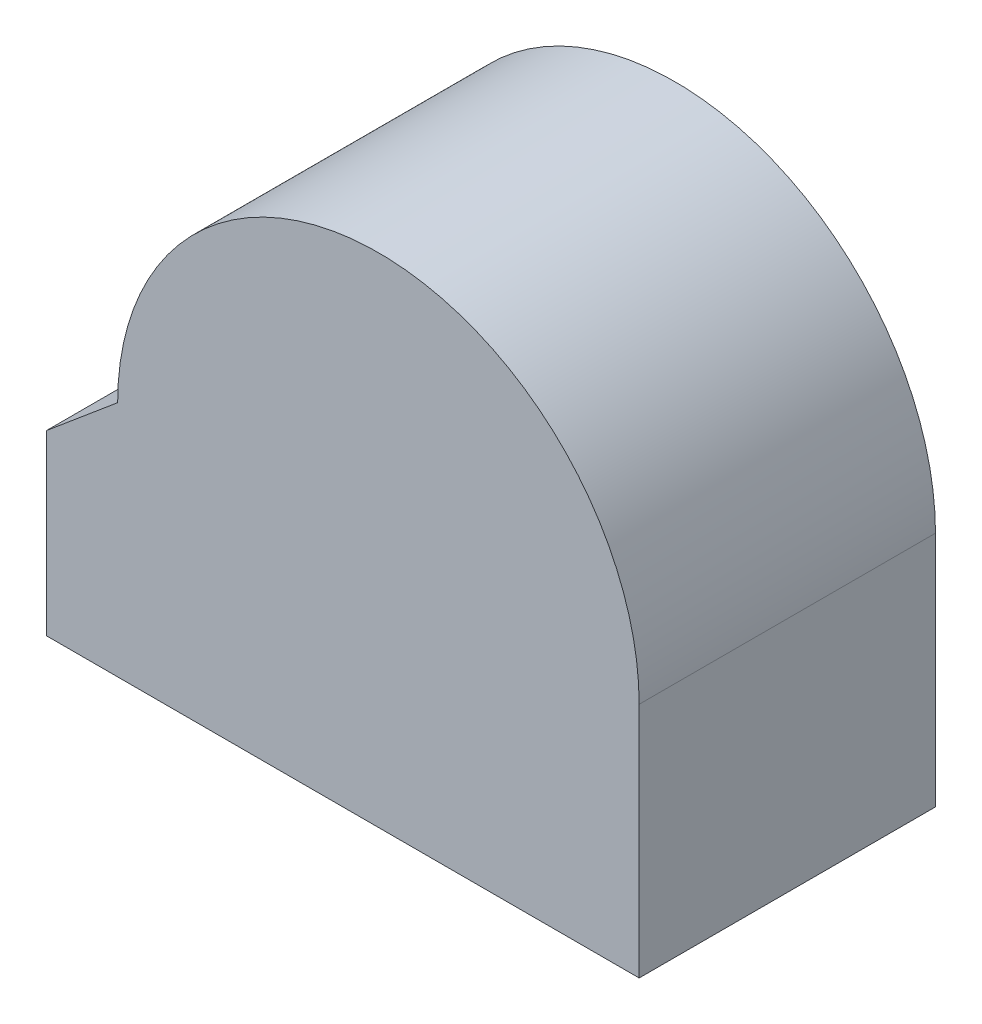
ISO-10303-21;
HEADER;
FILE_DESCRIPTION(('STEP AP214'),'2;1');
FILE_NAME('part.step','',(''),(''),'','','');
FILE_SCHEMA(('AUTOMOTIVE_DESIGN { 1 0 10303 214 1 1 1 1 }'));
ENDSEC;
DATA;
#1=APPLICATION_CONTEXT('core data for automotive mechanical design processes');
#2=APPLICATION_PROTOCOL_DEFINITION('international standard','automotive_design',2000,#1);
#3=PRODUCT_CONTEXT('',#1,'mechanical');
#4=PRODUCT('Part','Part','',(#3));
#5=PRODUCT_RELATED_PRODUCT_CATEGORY('part','',(#4));
#6=PRODUCT_DEFINITION_FORMATION('','',#4);
#7=PRODUCT_DEFINITION_CONTEXT('part definition',#1,'design');
#8=PRODUCT_DEFINITION('design','',#6,#7);
#9=PRODUCT_DEFINITION_SHAPE('','',#8);
#10=(LENGTH_UNIT() NAMED_UNIT(*) SI_UNIT(.MILLI.,.METRE.));
#11=(NAMED_UNIT(*) PLANE_ANGLE_UNIT() SI_UNIT($,.RADIAN.));
#12=(NAMED_UNIT(*) SI_UNIT($,.STERADIAN.) SOLID_ANGLE_UNIT());
#13=UNCERTAINTY_MEASURE_WITH_UNIT(LENGTH_MEASURE(1.E-05),#10,'distance_accuracy_value','');
#14=(GEOMETRIC_REPRESENTATION_CONTEXT(3) GLOBAL_UNCERTAINTY_ASSIGNED_CONTEXT((#13)) GLOBAL_UNIT_ASSIGNED_CONTEXT((#10,
#11,#12)) REPRESENTATION_CONTEXT('',''));
#15=CARTESIAN_POINT('',(0.,0.,0.));
#16=DIRECTION('',(0.,0.,1.));
#17=DIRECTION('',(1.,0.,0.));
#18=AXIS2_PLACEMENT_3D('',#15,#16,#17);
#19=CARTESIAN_POINT('',(3.00000000000001,20.,-61.6934955049954));
#20=DIRECTION('',(0.,0.,1.));
#21=DIRECTION('',(1.,0.,0.));
#22=AXIS2_PLACEMENT_3D('',#19,#20,#21);
#23=CYLINDRICAL_SURFACE('',#22,20.);
#24=CARTESIAN_POINT('',(3.00000000000001,20.,10.5));
#25=DIRECTION('',(0.,0.,1.));
#26=DIRECTION('',(1.,0.,0.));
#27=AXIS2_PLACEMENT_3D('',#24,#25,#26);
#28=CIRCLE('',#27,20.);
#29=CARTESIAN_POINT('',(23.,20.,10.5));
#30=VERTEX_POINT('',#29);
#31=CARTESIAN_POINT('',(-17.,20.,10.5));
#32=VERTEX_POINT('',#31);
#33=EDGE_CURVE('E132',#30,#32,#28,.T.);
#34=ORIENTED_EDGE('',*,*,#33,.T.);
#35=DIRECTION('',(0.,0.,1.));
#36=VECTOR('',#35,1.);
#37=CARTESIAN_POINT('',(-17.,20.,-61.6934955049954));
#38=LINE('',#37,#36);
#39=CARTESIAN_POINT('',(-17.,20.,-12.5));
#40=VERTEX_POINT('',#39);
#41=EDGE_CURVE('E160',#40,#32,#38,.T.);
#42=ORIENTED_EDGE('',*,*,#41,.F.);
#43=CARTESIAN_POINT('',(3.00000000000001,20.,-12.5));
#44=DIRECTION('',(0.,0.,1.));
#45=DIRECTION('',(1.,0.,0.));
#46=AXIS2_PLACEMENT_3D('',#43,#44,#45);
#47=CIRCLE('',#46,20.);
#48=CARTESIAN_POINT('',(23.,20.,-12.5));
#49=VERTEX_POINT('',#48);
#50=EDGE_CURVE('E159',#40,#49,#47,.F.);
#51=ORIENTED_EDGE('',*,*,#50,.T.);
#52=DIRECTION('',(0.,0.,1.));
#53=VECTOR('',#52,1.);
#54=CARTESIAN_POINT('',(23.,20.,-61.6934955049954));
#55=LINE('',#54,#53);
#56=EDGE_CURVE('E168',#49,#30,#55,.T.);
#57=ORIENTED_EDGE('',*,*,#56,.T.);
#58=EDGE_LOOP('',(#34,#42,#51,#57));
#59=FACE_BOUND('',#58,.T.);
#60=ADVANCED_FACE('F38',(#59),#23,.F.);
#61=CARTESIAN_POINT('',(25.,20.,12.5));
#62=DIRECTION('',(-1.,0.,0.));
#63=DIRECTION('',(0.,0.,1.));
#64=AXIS2_PLACEMENT_3D('',#61,#62,#63);
#65=PLANE('',#64);
#66=DIRECTION('',(0.,0.,-1.));
#67=VECTOR('',#66,1.);
#68=CARTESIAN_POINT('',(25.,0.,12.5));
#69=LINE('',#68,#67);
#70=CARTESIAN_POINT('',(25.,0.,12.5));
#71=VERTEX_POINT('',#70);
#72=CARTESIAN_POINT('',(25.,0.,-12.5));
#73=VERTEX_POINT('',#72);
#74=EDGE_CURVE('E164',#71,#73,#69,.T.);
#75=ORIENTED_EDGE('',*,*,#74,.T.);
#76=DIRECTION('',(0.,-1.,0.));
#77=VECTOR('',#76,1.);
#78=CARTESIAN_POINT('',(25.,20.,-12.5));
#79=LINE('',#78,#77);
#80=CARTESIAN_POINT('',(25.,20.,-12.5));
#81=VERTEX_POINT('',#80);
#82=EDGE_CURVE('E212',#81,#73,#79,.T.);
#83=ORIENTED_EDGE('',*,*,#82,.F.);
#84=DIRECTION('',(0.,0.,-1.));
#85=VECTOR('',#84,1.);
#86=CARTESIAN_POINT('',(25.,20.,12.5));
#87=LINE('',#86,#85);
#88=CARTESIAN_POINT('',(25.,20.,12.5));
#89=VERTEX_POINT('',#88);
#90=EDGE_CURVE('E177',#89,#81,#87,.T.);
#91=ORIENTED_EDGE('',*,*,#90,.F.);
#92=DIRECTION('',(0.,-1.,0.));
#93=VECTOR('',#92,1.);
#94=CARTESIAN_POINT('',(25.,20.,12.5));
#95=LINE('',#94,#93);
#96=EDGE_CURVE('E189',#89,#71,#95,.T.);
#97=ORIENTED_EDGE('',*,*,#96,.T.);
#98=EDGE_LOOP('',(#75,#83,#91,#97));
#99=FACE_BOUND('',#98,.T.);
#100=ADVANCED_FACE('F244',(#99),#65,.F.);
#101=CARTESIAN_POINT('',(-25.,20.,-12.5));
#102=DIRECTION('',(0.,0.,1.));
#103=DIRECTION('',(1.,0.,0.));
#104=AXIS2_PLACEMENT_3D('',#101,#102,#103);
#105=PLANE('',#104);
#106=DIRECTION('',(0.,-1.,0.));
#107=VECTOR('',#106,1.);
#108=CARTESIAN_POINT('',(-25.,20.,-12.5));
#109=LINE('',#108,#107);
#110=CARTESIAN_POINT('',(-25.,15.,-12.5));
#111=VERTEX_POINT('',#110);
#112=CARTESIAN_POINT('',(-25.,0.,-12.5));
#113=VERTEX_POINT('',#112);
#114=EDGE_CURVE('E209',#111,#113,#109,.T.);
#115=ORIENTED_EDGE('',*,*,#114,.F.);
#116=DIRECTION('',(-0.766044443118977,-0.64278760968654,0.));
#117=VECTOR('',#116,1.);
#118=CARTESIAN_POINT('',(-19.0412320370289,20.,-12.5));
#119=LINE('',#118,#117);
#120=CARTESIAN_POINT('',(-19.0412320370289,20.,-12.5));
#121=VERTEX_POINT('',#120);
#122=EDGE_CURVE('E11',#111,#121,#119,.F.);
#123=ORIENTED_EDGE('',*,*,#122,.T.);
#124=DIRECTION('',(-1.,0.,0.));
#125=VECTOR('',#124,1.);
#126=CARTESIAN_POINT('',(-25.,20.,-12.5));
#127=LINE('',#126,#125);
#128=CARTESIAN_POINT('',(-19.,20.,-12.5));
#129=VERTEX_POINT('',#128);
#130=EDGE_CURVE('E181',#129,#121,#127,.T.);
#131=ORIENTED_EDGE('',*,*,#130,.F.);
#132=CARTESIAN_POINT('',(3.00000000000001,20.,-12.5));
#133=DIRECTION('',(0.,0.,1.));
#134=DIRECTION('',(1.,0.,0.));
#135=AXIS2_PLACEMENT_3D('',#132,#133,#134);
#136=CIRCLE('',#135,22.);
#137=EDGE_CURVE('E155',#129,#81,#136,.F.);
#138=ORIENTED_EDGE('',*,*,#137,.T.);
#139=ORIENTED_EDGE('',*,*,#82,.T.);
#140=DIRECTION('',(-1.,0.,0.));
#141=VECTOR('',#140,1.);
#142=CARTESIAN_POINT('',(-25.,0.,-12.5));
#143=LINE('',#142,#141);
#144=CARTESIAN_POINT('',(23.,0.,-12.5));
#145=VERTEX_POINT('',#144);
#146=EDGE_CURVE('E194',#73,#145,#143,.T.);
#147=ORIENTED_EDGE('',*,*,#146,.T.);
#148=DIRECTION('',(0.,1.,0.));
#149=VECTOR('',#148,1.);
#150=CARTESIAN_POINT('',(23.,-46.1410879802373,-12.5));
#151=LINE('',#150,#149);
#152=EDGE_CURVE('E119',#145,#49,#151,.T.);
#153=ORIENTED_EDGE('',*,*,#152,.T.);
#154=ORIENTED_EDGE('',*,*,#50,.F.);
#155=DIRECTION('',(0.,1.,0.));
#156=VECTOR('',#155,1.);
#157=CARTESIAN_POINT('',(-17.,-46.1410879802373,-12.5));
#158=LINE('',#157,#156);
#159=CARTESIAN_POINT('',(-17.,0.,-12.5));
#160=VERTEX_POINT('',#159);
#161=EDGE_CURVE('E144',#160,#40,#158,.T.);
#162=ORIENTED_EDGE('',*,*,#161,.F.);
#163=EDGE_CURVE('E193',#160,#113,#143,.T.);
#164=ORIENTED_EDGE('',*,*,#163,.T.);
#165=EDGE_LOOP('',(#115,#123,#131,#138,#139,#147,#153,#154,#162,#164));
#166=FACE_BOUND('',#165,.T.);
#167=ADVANCED_FACE('F227',(#166),#105,.F.);
#168=CARTESIAN_POINT('',(-25.,20.,12.5));
#169=DIRECTION('',(1.,0.,0.));
#170=DIRECTION('',(0.,0.,-1.));
#171=AXIS2_PLACEMENT_3D('',#168,#169,#170);
#172=PLANE('',#171);
#173=DIRECTION('',(0.,-1.,0.));
#174=VECTOR('',#173,1.);
#175=CARTESIAN_POINT('',(-25.,20.,12.5));
#176=LINE('',#175,#174);
#177=CARTESIAN_POINT('',(-25.,15.,12.5));
#178=VERTEX_POINT('',#177);
#179=CARTESIAN_POINT('',(-25.,0.,12.5));
#180=VERTEX_POINT('',#179);
#181=EDGE_CURVE('E206',#178,#180,#176,.T.);
#182=ORIENTED_EDGE('',*,*,#181,.F.);
#183=DIRECTION('',(0.,0.,-1.));
#184=VECTOR('',#183,1.);
#185=CARTESIAN_POINT('',(-25.,15.,12.5));
#186=LINE('',#185,#184);
#187=EDGE_CURVE('E47',#178,#111,#186,.T.);
#188=ORIENTED_EDGE('',*,*,#187,.T.);
#189=ORIENTED_EDGE('',*,*,#114,.T.);
#190=DIRECTION('',(0.,0.,1.));
#191=VECTOR('',#190,1.);
#192=CARTESIAN_POINT('',(-25.,0.,12.5));
#193=LINE('',#192,#191);
#194=EDGE_CURVE('E197',#113,#180,#193,.T.);
#195=ORIENTED_EDGE('',*,*,#194,.T.);
#196=EDGE_LOOP('',(#182,#188,#189,#195));
#197=FACE_BOUND('',#196,.T.);
#198=ADVANCED_FACE('F232',(#197),#172,.F.);
#199=CARTESIAN_POINT('',(-25.,20.,12.5));
#200=DIRECTION('',(0.,0.,-1.));
#201=DIRECTION('',(-1.,0.,0.));
#202=AXIS2_PLACEMENT_3D('',#199,#200,#201);
#203=PLANE('',#202);
#204=DIRECTION('',(1.,0.,0.));
#205=VECTOR('',#204,1.);
#206=CARTESIAN_POINT('',(-25.,20.,12.5));
#207=LINE('',#206,#205);
#208=CARTESIAN_POINT('',(-19.0412320370289,20.,12.5));
#209=VERTEX_POINT('',#208);
#210=CARTESIAN_POINT('',(-19.,20.,12.5));
#211=VERTEX_POINT('',#210);
#212=EDGE_CURVE('E186',#209,#211,#207,.T.);
#213=ORIENTED_EDGE('',*,*,#212,.F.);
#214=DIRECTION('',(0.766044443118977,0.64278760968654,0.));
#215=VECTOR('',#214,1.);
#216=CARTESIAN_POINT('',(-19.0412320370289,20.,12.5));
#217=LINE('',#216,#215);
#218=EDGE_CURVE('E61',#209,#178,#217,.F.);
#219=ORIENTED_EDGE('',*,*,#218,.T.);
#220=ORIENTED_EDGE('',*,*,#181,.T.);
#221=DIRECTION('',(1.,0.,0.));
#222=VECTOR('',#221,1.);
#223=CARTESIAN_POINT('',(-25.,0.,12.5));
#224=LINE('',#223,#222);
#225=EDGE_CURVE('E182',#180,#71,#224,.T.);
#226=ORIENTED_EDGE('',*,*,#225,.T.);
#227=ORIENTED_EDGE('',*,*,#96,.F.);
#228=CARTESIAN_POINT('',(3.00000000000001,20.,12.5));
#229=DIRECTION('',(0.,0.,1.));
#230=DIRECTION('',(1.,0.,0.));
#231=AXIS2_PLACEMENT_3D('',#228,#229,#230);
#232=CIRCLE('',#231,22.);
#233=EDGE_CURVE('E154',#89,#211,#232,.T.);
#234=ORIENTED_EDGE('',*,*,#233,.T.);
#235=EDGE_LOOP('',(#213,#219,#220,#226,#227,#234));
#236=FACE_BOUND('',#235,.T.);
#237=ADVANCED_FACE('F245',(#236),#203,.F.);
#238=CARTESIAN_POINT('',(0.,20.,0.));
#239=DIRECTION('',(0.,-1.,0.));
#240=DIRECTION('',(0.,0.,-1.));
#241=AXIS2_PLACEMENT_3D('',#238,#239,#240);
#242=PLANE('',#241);
#243=ORIENTED_EDGE('',*,*,#130,.T.);
#244=DIRECTION('',(0.,0.,1.));
#245=VECTOR('',#244,1.);
#246=CARTESIAN_POINT('',(-19.0412320370289,20.,0.));
#247=LINE('',#246,#245);
#248=EDGE_CURVE('E216',#121,#209,#247,.T.);
#249=ORIENTED_EDGE('',*,*,#248,.T.);
#250=ORIENTED_EDGE('',*,*,#212,.T.);
#251=DIRECTION('',(0.,0.,1.));
#252=VECTOR('',#251,1.);
#253=CARTESIAN_POINT('',(-19.,20.,-61.6934955049954));
#254=LINE('',#253,#252);
#255=EDGE_CURVE('E171',#129,#211,#254,.T.);
#256=ORIENTED_EDGE('',*,*,#255,.F.);
#257=EDGE_LOOP('',(#243,#249,#250,#256));
#258=FACE_BOUND('',#257,.T.);
#259=ADVANCED_FACE('F237',(#258),#242,.F.);
#260=CARTESIAN_POINT('',(0.,0.,0.));
#261=DIRECTION('',(0.,-1.,0.));
#262=DIRECTION('',(0.,0.,-1.));
#263=AXIS2_PLACEMENT_3D('',#260,#261,#262);
#264=PLANE('',#263);
#265=DIRECTION('',(0.,0.,-1.));
#266=VECTOR('',#265,1.);
#267=CARTESIAN_POINT('',(23.,0.,10.5));
#268=LINE('',#267,#266);
#269=CARTESIAN_POINT('',(23.,0.,10.5));
#270=VERTEX_POINT('',#269);
#271=EDGE_CURVE('E113',#270,#145,#268,.T.);
#272=ORIENTED_EDGE('',*,*,#271,.T.);
#273=ORIENTED_EDGE('',*,*,#146,.F.);
#274=ORIENTED_EDGE('',*,*,#74,.F.);
#275=ORIENTED_EDGE('',*,*,#225,.F.);
#276=ORIENTED_EDGE('',*,*,#194,.F.);
#277=ORIENTED_EDGE('',*,*,#163,.F.);
#278=DIRECTION('',(0.,0.,1.));
#279=VECTOR('',#278,1.);
#280=CARTESIAN_POINT('',(-17.,0.,-12.5));
#281=LINE('',#280,#279);
#282=CARTESIAN_POINT('',(-17.,0.,10.5));
#283=VERTEX_POINT('',#282);
#284=EDGE_CURVE('E138',#160,#283,#281,.T.);
#285=ORIENTED_EDGE('',*,*,#284,.T.);
#286=DIRECTION('',(1.,0.,0.));
#287=VECTOR('',#286,1.);
#288=CARTESIAN_POINT('',(-17.,0.,10.5));
#289=LINE('',#288,#287);
#290=EDGE_CURVE('E129',#283,#270,#289,.T.);
#291=ORIENTED_EDGE('',*,*,#290,.T.);
#292=EDGE_LOOP('',(#272,#273,#274,#275,#276,#277,#285,#291));
#293=FACE_BOUND('',#292,.T.);
#294=ADVANCED_FACE('F136',(#293),#264,.T.);
#295=CARTESIAN_POINT('',(3.00000000000001,20.,-61.6934955049954));
#296=DIRECTION('',(0.,0.,1.));
#297=DIRECTION('',(1.,0.,0.));
#298=AXIS2_PLACEMENT_3D('',#295,#296,#297);
#299=CYLINDRICAL_SURFACE('',#298,22.);
#300=ORIENTED_EDGE('',*,*,#137,.F.);
#301=ORIENTED_EDGE('',*,*,#255,.T.);
#302=ORIENTED_EDGE('',*,*,#233,.F.);
#303=ORIENTED_EDGE('',*,*,#90,.T.);
#304=EDGE_LOOP('',(#300,#301,#302,#303));
#305=FACE_BOUND('',#304,.T.);
#306=ADVANCED_FACE('F241',(#305),#299,.T.);
#307=CARTESIAN_POINT('',(0.,0.,10.5));
#308=DIRECTION('',(0.,0.,1.));
#309=DIRECTION('',(1.,0.,0.));
#310=AXIS2_PLACEMENT_3D('',#307,#308,#309);
#311=PLANE('',#310);
#312=ORIENTED_EDGE('',*,*,#33,.F.);
#313=DIRECTION('',(0.,1.,0.));
#314=VECTOR('',#313,1.);
#315=CARTESIAN_POINT('',(23.,-46.1410879802373,10.5));
#316=LINE('',#315,#314);
#317=EDGE_CURVE('E116',#270,#30,#316,.T.);
#318=ORIENTED_EDGE('',*,*,#317,.F.);
#319=ORIENTED_EDGE('',*,*,#290,.F.);
#320=DIRECTION('',(0.,1.,0.));
#321=VECTOR('',#320,1.);
#322=CARTESIAN_POINT('',(-17.,-46.1410879802373,10.5));
#323=LINE('',#322,#321);
#324=EDGE_CURVE('E143',#283,#32,#323,.T.);
#325=ORIENTED_EDGE('',*,*,#324,.T.);
#326=EDGE_LOOP('',(#312,#318,#319,#325));
#327=FACE_BOUND('',#326,.T.);
#328=ADVANCED_FACE('F127',(#327),#311,.F.);
#329=CARTESIAN_POINT('',(23.,-46.1410879802373,10.5));
#330=DIRECTION('',(1.,0.,0.));
#331=DIRECTION('',(0.,0.,-1.));
#332=AXIS2_PLACEMENT_3D('',#329,#330,#331);
#333=PLANE('',#332);
#334=ORIENTED_EDGE('',*,*,#317,.T.);
#335=ORIENTED_EDGE('',*,*,#56,.F.);
#336=ORIENTED_EDGE('',*,*,#152,.F.);
#337=ORIENTED_EDGE('',*,*,#271,.F.);
#338=EDGE_LOOP('',(#334,#335,#336,#337));
#339=FACE_BOUND('',#338,.T.);
#340=ADVANCED_FACE('F115',(#339),#333,.F.);
#341=CARTESIAN_POINT('',(-17.,-46.1410879802373,-12.5));
#342=DIRECTION('',(-1.,0.,0.));
#343=DIRECTION('',(0.,0.,1.));
#344=AXIS2_PLACEMENT_3D('',#341,#342,#343);
#345=PLANE('',#344);
#346=ORIENTED_EDGE('',*,*,#161,.T.);
#347=ORIENTED_EDGE('',*,*,#41,.T.);
#348=ORIENTED_EDGE('',*,*,#324,.F.);
#349=ORIENTED_EDGE('',*,*,#284,.F.);
#350=EDGE_LOOP('',(#346,#347,#348,#349));
#351=FACE_BOUND('',#350,.T.);
#352=ADVANCED_FACE('F274',(#351),#345,.F.);
#353=CARTESIAN_POINT('',(-19.0412320370289,20.,0.));
#354=DIRECTION('',(0.64278760968654,-0.766044443118977,0.));
#355=DIRECTION('',(0.,0.,1.));
#356=AXIS2_PLACEMENT_3D('',#353,#354,#355);
#357=PLANE('',#356);
#358=ORIENTED_EDGE('',*,*,#122,.F.);
#359=ORIENTED_EDGE('',*,*,#187,.F.);
#360=ORIENTED_EDGE('',*,*,#218,.F.);
#361=ORIENTED_EDGE('',*,*,#248,.F.);
#362=EDGE_LOOP('',(#358,#359,#360,#361));
#363=FACE_BOUND('',#362,.T.);
#364=ADVANCED_FACE('F40',(#363),#357,.F.);
#365=CLOSED_SHELL('',(#60,#100,#167,#198,#237,#259,#294,#306,#328,#340,#352,#364));
#366=MANIFOLD_SOLID_BREP('B2',#365);
#367=ADVANCED_BREP_SHAPE_REPRESENTATION('',(#18,#366),#14);
#368=SHAPE_DEFINITION_REPRESENTATION(#9,#367);
ENDSEC;
END-ISO-10303-21;
